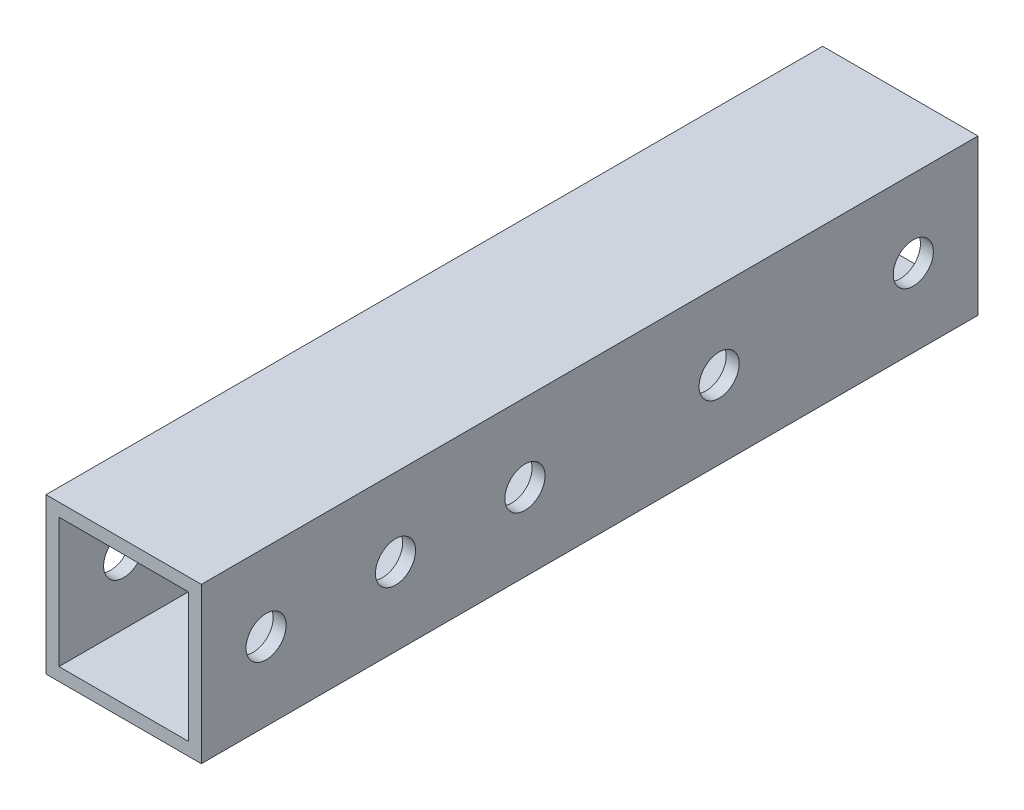
ISO-10303-21;
HEADER;
FILE_DESCRIPTION(('STEP AP214'),'2;1');
FILE_NAME('part.step','',(''),(''),'','','');
FILE_SCHEMA(('AUTOMOTIVE_DESIGN { 1 0 10303 214 1 1 1 1 }'));
ENDSEC;
DATA;
#1=APPLICATION_CONTEXT('core data for automotive mechanical design processes');
#2=APPLICATION_PROTOCOL_DEFINITION('international standard','automotive_design',2000,#1);
#3=PRODUCT_CONTEXT('',#1,'mechanical');
#4=PRODUCT('Part','Part','',(#3));
#5=PRODUCT_RELATED_PRODUCT_CATEGORY('part','',(#4));
#6=PRODUCT_DEFINITION_FORMATION('','',#4);
#7=PRODUCT_DEFINITION_CONTEXT('part definition',#1,'design');
#8=PRODUCT_DEFINITION('design','',#6,#7);
#9=PRODUCT_DEFINITION_SHAPE('','',#8);
#10=(LENGTH_UNIT() NAMED_UNIT(*) SI_UNIT(.MILLI.,.METRE.));
#11=(NAMED_UNIT(*) PLANE_ANGLE_UNIT() SI_UNIT($,.RADIAN.));
#12=(NAMED_UNIT(*) SI_UNIT($,.STERADIAN.) SOLID_ANGLE_UNIT());
#13=UNCERTAINTY_MEASURE_WITH_UNIT(LENGTH_MEASURE(1.E-05),#10,'distance_accuracy_value','');
#14=(GEOMETRIC_REPRESENTATION_CONTEXT(3) GLOBAL_UNCERTAINTY_ASSIGNED_CONTEXT((#13)) GLOBAL_UNIT_ASSIGNED_CONTEXT((#10,
#11,#12)) REPRESENTATION_CONTEXT('',''));
#15=CARTESIAN_POINT('',(0.,0.,0.));
#16=DIRECTION('',(0.,0.,1.));
#17=DIRECTION('',(1.,0.,0.));
#18=AXIS2_PLACEMENT_3D('',#15,#16,#17);
#19=CARTESIAN_POINT('',(0.,0.,60.));
#20=DIRECTION('',(0.,0.,-1.));
#21=DIRECTION('',(-1.,0.,0.));
#22=AXIS2_PLACEMENT_3D('',#19,#20,#21);
#23=PLANE('',#22);
#24=DIRECTION('',(0.,-1.,0.));
#25=VECTOR('',#24,1.);
#26=CARTESIAN_POINT('',(0.,0.,60.));
#27=LINE('',#26,#25);
#28=CARTESIAN_POINT('',(0.,12.,60.));
#29=VERTEX_POINT('',#28);
#30=CARTESIAN_POINT('',(0.,0.,60.));
#31=VERTEX_POINT('',#30);
#32=EDGE_CURVE('E164',#29,#31,#27,.T.);
#33=ORIENTED_EDGE('',*,*,#32,.T.);
#34=DIRECTION('',(1.,0.,0.));
#35=VECTOR('',#34,1.);
#36=CARTESIAN_POINT('',(0.,0.,60.));
#37=LINE('',#36,#35);
#38=CARTESIAN_POINT('',(12.,0.,60.));
#39=VERTEX_POINT('',#38);
#40=EDGE_CURVE('E168',#31,#39,#37,.T.);
#41=ORIENTED_EDGE('',*,*,#40,.T.);
#42=DIRECTION('',(0.,1.,0.));
#43=VECTOR('',#42,1.);
#44=CARTESIAN_POINT('',(12.,0.,60.));
#45=LINE('',#44,#43);
#46=CARTESIAN_POINT('',(12.,12.,60.));
#47=VERTEX_POINT('',#46);
#48=EDGE_CURVE('E172',#39,#47,#45,.T.);
#49=ORIENTED_EDGE('',*,*,#48,.T.);
#50=DIRECTION('',(-1.,0.,0.));
#51=VECTOR('',#50,1.);
#52=CARTESIAN_POINT('',(0.,12.,60.));
#53=LINE('',#52,#51);
#54=EDGE_CURVE('E175',#47,#29,#53,.T.);
#55=ORIENTED_EDGE('',*,*,#54,.T.);
#56=EDGE_LOOP('',(#33,#41,#49,#55));
#57=FACE_BOUND('',#56,.T.);
#58=DIRECTION('',(1.,0.,0.));
#59=VECTOR('',#58,1.);
#60=CARTESIAN_POINT('',(1.,1.,60.));
#61=LINE('',#60,#59);
#62=CARTESIAN_POINT('',(1.,1.,60.));
#63=VERTEX_POINT('',#62);
#64=CARTESIAN_POINT('',(11.,1.,60.));
#65=VERTEX_POINT('',#64);
#66=EDGE_CURVE('E113',#63,#65,#61,.T.);
#67=ORIENTED_EDGE('',*,*,#66,.F.);
#68=DIRECTION('',(0.,-1.,0.));
#69=VECTOR('',#68,1.);
#70=CARTESIAN_POINT('',(1.,1.,60.));
#71=LINE('',#70,#69);
#72=CARTESIAN_POINT('',(1.,11.,60.));
#73=VERTEX_POINT('',#72);
#74=EDGE_CURVE('E140',#73,#63,#71,.T.);
#75=ORIENTED_EDGE('',*,*,#74,.F.);
#76=DIRECTION('',(-1.,0.,0.));
#77=VECTOR('',#76,1.);
#78=CARTESIAN_POINT('',(1.,11.,60.));
#79=LINE('',#78,#77);
#80=CARTESIAN_POINT('',(11.,11.,60.));
#81=VERTEX_POINT('',#80);
#82=EDGE_CURVE('E135',#81,#73,#79,.T.);
#83=ORIENTED_EDGE('',*,*,#82,.F.);
#84=DIRECTION('',(0.,1.,0.));
#85=VECTOR('',#84,1.);
#86=CARTESIAN_POINT('',(11.,1.,60.));
#87=LINE('',#86,#85);
#88=EDGE_CURVE('E122',#65,#81,#87,.T.);
#89=ORIENTED_EDGE('',*,*,#88,.F.);
#90=EDGE_LOOP('',(#67,#75,#83,#89));
#91=FACE_BOUND('',#90,.T.);
#92=ADVANCED_FACE('F45',(#57,#91),#23,.F.);
#93=CARTESIAN_POINT('',(0.,0.,0.));
#94=DIRECTION('',(0.,0.,-1.));
#95=DIRECTION('',(-1.,0.,0.));
#96=AXIS2_PLACEMENT_3D('',#93,#94,#95);
#97=PLANE('',#96);
#98=DIRECTION('',(0.,-1.,0.));
#99=VECTOR('',#98,1.);
#100=CARTESIAN_POINT('',(0.,0.,0.));
#101=LINE('',#100,#99);
#102=CARTESIAN_POINT('',(0.,12.,0.));
#103=VERTEX_POINT('',#102);
#104=CARTESIAN_POINT('',(0.,0.,0.));
#105=VERTEX_POINT('',#104);
#106=EDGE_CURVE('E131',#103,#105,#101,.T.);
#107=ORIENTED_EDGE('',*,*,#106,.F.);
#108=DIRECTION('',(-1.,0.,0.));
#109=VECTOR('',#108,1.);
#110=CARTESIAN_POINT('',(0.,12.,0.));
#111=LINE('',#110,#109);
#112=CARTESIAN_POINT('',(12.,12.,0.));
#113=VERTEX_POINT('',#112);
#114=EDGE_CURVE('E169',#113,#103,#111,.T.);
#115=ORIENTED_EDGE('',*,*,#114,.F.);
#116=DIRECTION('',(0.,1.,0.));
#117=VECTOR('',#116,1.);
#118=CARTESIAN_POINT('',(12.,0.,0.));
#119=LINE('',#118,#117);
#120=CARTESIAN_POINT('',(12.,0.,0.));
#121=VERTEX_POINT('',#120);
#122=EDGE_CURVE('E184',#121,#113,#119,.T.);
#123=ORIENTED_EDGE('',*,*,#122,.F.);
#124=DIRECTION('',(1.,0.,0.));
#125=VECTOR('',#124,1.);
#126=CARTESIAN_POINT('',(0.,0.,0.));
#127=LINE('',#126,#125);
#128=EDGE_CURVE('E181',#105,#121,#127,.T.);
#129=ORIENTED_EDGE('',*,*,#128,.F.);
#130=EDGE_LOOP('',(#107,#115,#123,#129));
#131=FACE_BOUND('',#130,.T.);
#132=DIRECTION('',(0.,-1.,0.));
#133=VECTOR('',#132,1.);
#134=CARTESIAN_POINT('',(1.,1.,0.));
#135=LINE('',#134,#133);
#136=CARTESIAN_POINT('',(1.,11.,0.));
#137=VERTEX_POINT('',#136);
#138=CARTESIAN_POINT('',(1.,1.,0.));
#139=VERTEX_POINT('',#138);
#140=EDGE_CURVE('E123',#137,#139,#135,.T.);
#141=ORIENTED_EDGE('',*,*,#140,.T.);
#142=DIRECTION('',(1.,0.,0.));
#143=VECTOR('',#142,1.);
#144=CARTESIAN_POINT('',(1.,1.,0.));
#145=LINE('',#144,#143);
#146=CARTESIAN_POINT('',(11.,1.,0.));
#147=VERTEX_POINT('',#146);
#148=EDGE_CURVE('E71',#139,#147,#145,.T.);
#149=ORIENTED_EDGE('',*,*,#148,.T.);
#150=DIRECTION('',(0.,1.,0.));
#151=VECTOR('',#150,1.);
#152=CARTESIAN_POINT('',(11.,1.,0.));
#153=LINE('',#152,#151);
#154=CARTESIAN_POINT('',(11.,11.,0.));
#155=VERTEX_POINT('',#154);
#156=EDGE_CURVE('E129',#147,#155,#153,.T.);
#157=ORIENTED_EDGE('',*,*,#156,.T.);
#158=DIRECTION('',(-1.,0.,0.));
#159=VECTOR('',#158,1.);
#160=CARTESIAN_POINT('',(1.,11.,0.));
#161=LINE('',#160,#159);
#162=EDGE_CURVE('E151',#155,#137,#161,.T.);
#163=ORIENTED_EDGE('',*,*,#162,.T.);
#164=EDGE_LOOP('',(#141,#149,#157,#163));
#165=FACE_BOUND('',#164,.T.);
#166=ADVANCED_FACE('F256',(#131,#165),#97,.T.);
#167=CARTESIAN_POINT('',(0.,0.,60.));
#168=DIRECTION('',(1.,0.,0.));
#169=DIRECTION('',(0.,0.,-1.));
#170=AXIS2_PLACEMENT_3D('',#167,#168,#169);
#171=PLANE('',#170);
#172=CARTESIAN_POINT('',(0.,6.,55.));
#173=DIRECTION('',(1.,0.,0.));
#174=DIRECTION('',(0.,0.,-1.));
#175=AXIS2_PLACEMENT_3D('',#172,#173,#174);
#176=CIRCLE('',#175,1.55);
#177=CARTESIAN_POINT('',(0.,6.,53.45));
#178=VERTEX_POINT('',#177);
#179=EDGE_CURVE('E302',#178,#178,#176,.T.);
#180=ORIENTED_EDGE('',*,*,#179,.T.);
#181=EDGE_LOOP('',(#180));
#182=FACE_BOUND('',#181,.T.);
#183=CARTESIAN_POINT('',(0.,6.00000000000001,5.));
#184=DIRECTION('',(1.,0.,0.));
#185=DIRECTION('',(0.,0.,-1.));
#186=AXIS2_PLACEMENT_3D('',#183,#184,#185);
#187=CIRCLE('',#186,1.55);
#188=CARTESIAN_POINT('',(0.,6.00000000000001,3.45));
#189=VERTEX_POINT('',#188);
#190=EDGE_CURVE('E306',#189,#189,#187,.T.);
#191=ORIENTED_EDGE('',*,*,#190,.T.);
#192=EDGE_LOOP('',(#191));
#193=FACE_BOUND('',#192,.T.);
#194=CARTESIAN_POINT('',(0.,6.00000000000001,20.));
#195=DIRECTION('',(1.,0.,0.));
#196=DIRECTION('',(0.,0.,-1.));
#197=AXIS2_PLACEMENT_3D('',#194,#195,#196);
#198=CIRCLE('',#197,1.55);
#199=CARTESIAN_POINT('',(0.,6.00000000000001,18.45));
#200=VERTEX_POINT('',#199);
#201=EDGE_CURVE('E310',#200,#200,#198,.T.);
#202=ORIENTED_EDGE('',*,*,#201,.T.);
#203=EDGE_LOOP('',(#202));
#204=FACE_BOUND('',#203,.T.);
#205=CARTESIAN_POINT('',(0.,6.,35.));
#206=DIRECTION('',(1.,0.,0.));
#207=DIRECTION('',(0.,0.,-1.));
#208=AXIS2_PLACEMENT_3D('',#205,#206,#207);
#209=CIRCLE('',#208,1.55);
#210=CARTESIAN_POINT('',(0.,6.,33.45));
#211=VERTEX_POINT('',#210);
#212=EDGE_CURVE('E314',#211,#211,#209,.T.);
#213=ORIENTED_EDGE('',*,*,#212,.T.);
#214=EDGE_LOOP('',(#213));
#215=FACE_BOUND('',#214,.T.);
#216=CARTESIAN_POINT('',(0.,6.,45.));
#217=DIRECTION('',(1.,0.,0.));
#218=DIRECTION('',(0.,0.,-1.));
#219=AXIS2_PLACEMENT_3D('',#216,#217,#218);
#220=CIRCLE('',#219,1.55);
#221=CARTESIAN_POINT('',(0.,6.,43.45));
#222=VERTEX_POINT('',#221);
#223=EDGE_CURVE('E204',#222,#222,#220,.T.);
#224=ORIENTED_EDGE('',*,*,#223,.T.);
#225=EDGE_LOOP('',(#224));
#226=FACE_BOUND('',#225,.T.);
#227=ORIENTED_EDGE('',*,*,#106,.T.);
#228=DIRECTION('',(0.,0.,-1.));
#229=VECTOR('',#228,1.);
#230=CARTESIAN_POINT('',(0.,0.,60.));
#231=LINE('',#230,#229);
#232=EDGE_CURVE('E11',#31,#105,#231,.T.);
#233=ORIENTED_EDGE('',*,*,#232,.F.);
#234=ORIENTED_EDGE('',*,*,#32,.F.);
#235=DIRECTION('',(0.,0.,-1.));
#236=VECTOR('',#235,1.);
#237=CARTESIAN_POINT('',(0.,12.,60.));
#238=LINE('',#237,#236);
#239=EDGE_CURVE('E178',#29,#103,#238,.T.);
#240=ORIENTED_EDGE('',*,*,#239,.T.);
#241=EDGE_LOOP('',(#227,#233,#234,#240));
#242=FACE_BOUND('',#241,.T.);
#243=ADVANCED_FACE('F47',(#182,#193,#204,#215,#226,#242),#171,.F.);
#244=CARTESIAN_POINT('',(0.,0.,60.));
#245=DIRECTION('',(0.,1.,0.));
#246=DIRECTION('',(0.,0.,1.));
#247=AXIS2_PLACEMENT_3D('',#244,#245,#246);
#248=PLANE('',#247);
#249=ORIENTED_EDGE('',*,*,#128,.T.);
#250=DIRECTION('',(0.,0.,-1.));
#251=VECTOR('',#250,1.);
#252=CARTESIAN_POINT('',(12.,0.,60.));
#253=LINE('',#252,#251);
#254=EDGE_CURVE('E55',#39,#121,#253,.T.);
#255=ORIENTED_EDGE('',*,*,#254,.F.);
#256=ORIENTED_EDGE('',*,*,#40,.F.);
#257=ORIENTED_EDGE('',*,*,#232,.T.);
#258=EDGE_LOOP('',(#249,#255,#256,#257));
#259=FACE_BOUND('',#258,.T.);
#260=ADVANCED_FACE('F279',(#259),#248,.F.);
#261=CARTESIAN_POINT('',(12.,0.,60.));
#262=DIRECTION('',(-1.,0.,0.));
#263=DIRECTION('',(0.,0.,1.));
#264=AXIS2_PLACEMENT_3D('',#261,#262,#263);
#265=PLANE('',#264);
#266=CARTESIAN_POINT('',(12.,6.,55.));
#267=DIRECTION('',(1.,0.,0.));
#268=DIRECTION('',(0.,0.,-1.));
#269=AXIS2_PLACEMENT_3D('',#266,#267,#268);
#270=CIRCLE('',#269,1.55);
#271=CARTESIAN_POINT('',(12.,6.,53.45));
#272=VERTEX_POINT('',#271);
#273=EDGE_CURVE('E324',#272,#272,#270,.T.);
#274=ORIENTED_EDGE('',*,*,#273,.F.);
#275=EDGE_LOOP('',(#274));
#276=FACE_BOUND('',#275,.T.);
#277=CARTESIAN_POINT('',(12.,6.00000000000001,5.));
#278=DIRECTION('',(1.,0.,0.));
#279=DIRECTION('',(0.,0.,-1.));
#280=AXIS2_PLACEMENT_3D('',#277,#278,#279);
#281=CIRCLE('',#280,1.55);
#282=CARTESIAN_POINT('',(12.,6.00000000000001,3.45));
#283=VERTEX_POINT('',#282);
#284=EDGE_CURVE('E374',#283,#283,#281,.T.);
#285=ORIENTED_EDGE('',*,*,#284,.F.);
#286=EDGE_LOOP('',(#285));
#287=FACE_BOUND('',#286,.T.);
#288=CARTESIAN_POINT('',(12.,6.00000000000001,20.));
#289=DIRECTION('',(1.,0.,0.));
#290=DIRECTION('',(0.,0.,-1.));
#291=AXIS2_PLACEMENT_3D('',#288,#289,#290);
#292=CIRCLE('',#291,1.55);
#293=CARTESIAN_POINT('',(12.,6.00000000000001,18.45));
#294=VERTEX_POINT('',#293);
#295=EDGE_CURVE('E380',#294,#294,#292,.T.);
#296=ORIENTED_EDGE('',*,*,#295,.F.);
#297=EDGE_LOOP('',(#296));
#298=FACE_BOUND('',#297,.T.);
#299=CARTESIAN_POINT('',(12.,6.,35.));
#300=DIRECTION('',(1.,0.,0.));
#301=DIRECTION('',(0.,0.,-1.));
#302=AXIS2_PLACEMENT_3D('',#299,#300,#301);
#303=CIRCLE('',#302,1.55);
#304=CARTESIAN_POINT('',(12.,6.,33.45));
#305=VERTEX_POINT('',#304);
#306=EDGE_CURVE('E386',#305,#305,#303,.T.);
#307=ORIENTED_EDGE('',*,*,#306,.F.);
#308=EDGE_LOOP('',(#307));
#309=FACE_BOUND('',#308,.T.);
#310=CARTESIAN_POINT('',(12.,6.,45.));
#311=DIRECTION('',(1.,0.,0.));
#312=DIRECTION('',(0.,0.,-1.));
#313=AXIS2_PLACEMENT_3D('',#310,#311,#312);
#314=CIRCLE('',#313,1.55);
#315=CARTESIAN_POINT('',(12.,6.,43.45));
#316=VERTEX_POINT('',#315);
#317=EDGE_CURVE('E319',#316,#316,#314,.T.);
#318=ORIENTED_EDGE('',*,*,#317,.F.);
#319=EDGE_LOOP('',(#318));
#320=FACE_BOUND('',#319,.T.);
#321=ORIENTED_EDGE('',*,*,#122,.T.);
#322=DIRECTION('',(0.,0.,-1.));
#323=VECTOR('',#322,1.);
#324=CARTESIAN_POINT('',(12.,12.,60.));
#325=LINE('',#324,#323);
#326=EDGE_CURVE('E192',#47,#113,#325,.T.);
#327=ORIENTED_EDGE('',*,*,#326,.F.);
#328=ORIENTED_EDGE('',*,*,#48,.F.);
#329=ORIENTED_EDGE('',*,*,#254,.T.);
#330=EDGE_LOOP('',(#321,#327,#328,#329));
#331=FACE_BOUND('',#330,.T.);
#332=ADVANCED_FACE('F276',(#276,#287,#298,#309,#320,#331),#265,.F.);
#333=CARTESIAN_POINT('',(0.,12.,60.));
#334=DIRECTION('',(0.,-1.,0.));
#335=DIRECTION('',(0.,0.,-1.));
#336=AXIS2_PLACEMENT_3D('',#333,#334,#335);
#337=PLANE('',#336);
#338=ORIENTED_EDGE('',*,*,#114,.T.);
#339=ORIENTED_EDGE('',*,*,#239,.F.);
#340=ORIENTED_EDGE('',*,*,#54,.F.);
#341=ORIENTED_EDGE('',*,*,#326,.T.);
#342=EDGE_LOOP('',(#338,#339,#340,#341));
#343=FACE_BOUND('',#342,.T.);
#344=ADVANCED_FACE('F273',(#343),#337,.F.);
#345=CARTESIAN_POINT('',(1.,1.,60.));
#346=DIRECTION('',(0.,1.,0.));
#347=DIRECTION('',(0.,0.,1.));
#348=AXIS2_PLACEMENT_3D('',#345,#346,#347);
#349=PLANE('',#348);
#350=ORIENTED_EDGE('',*,*,#148,.F.);
#351=DIRECTION('',(0.,0.,-1.));
#352=VECTOR('',#351,1.);
#353=CARTESIAN_POINT('',(1.,1.,60.));
#354=LINE('',#353,#352);
#355=EDGE_CURVE('E117',#63,#139,#354,.T.);
#356=ORIENTED_EDGE('',*,*,#355,.F.);
#357=ORIENTED_EDGE('',*,*,#66,.T.);
#358=DIRECTION('',(0.,0.,-1.));
#359=VECTOR('',#358,1.);
#360=CARTESIAN_POINT('',(11.,1.,60.));
#361=LINE('',#360,#359);
#362=EDGE_CURVE('E116',#65,#147,#361,.T.);
#363=ORIENTED_EDGE('',*,*,#362,.T.);
#364=EDGE_LOOP('',(#350,#356,#357,#363));
#365=FACE_BOUND('',#364,.T.);
#366=ADVANCED_FACE('F115',(#365),#349,.T.);
#367=CARTESIAN_POINT('',(11.,1.,60.));
#368=DIRECTION('',(-1.,0.,0.));
#369=DIRECTION('',(0.,0.,1.));
#370=AXIS2_PLACEMENT_3D('',#367,#368,#369);
#371=PLANE('',#370);
#372=CARTESIAN_POINT('',(11.,6.,55.));
#373=DIRECTION('',(-1.,0.,0.));
#374=DIRECTION('',(0.,0.,1.));
#375=AXIS2_PLACEMENT_3D('',#372,#373,#374);
#376=CIRCLE('',#375,1.55);
#377=CARTESIAN_POINT('',(11.,6.,56.55));
#378=VERTEX_POINT('',#377);
#379=EDGE_CURVE('E148',#378,#378,#376,.T.);
#380=ORIENTED_EDGE('',*,*,#379,.F.);
#381=EDGE_LOOP('',(#380));
#382=FACE_BOUND('',#381,.T.);
#383=CARTESIAN_POINT('',(11.,6.00000000000001,5.));
#384=DIRECTION('',(-1.,0.,0.));
#385=DIRECTION('',(0.,0.,1.));
#386=AXIS2_PLACEMENT_3D('',#383,#384,#385);
#387=CIRCLE('',#386,1.55);
#388=CARTESIAN_POINT('',(11.,6.00000000000001,6.55));
#389=VERTEX_POINT('',#388);
#390=EDGE_CURVE('E217',#389,#389,#387,.T.);
#391=ORIENTED_EDGE('',*,*,#390,.F.);
#392=EDGE_LOOP('',(#391));
#393=FACE_BOUND('',#392,.T.);
#394=CARTESIAN_POINT('',(11.,6.00000000000001,20.));
#395=DIRECTION('',(-1.,0.,0.));
#396=DIRECTION('',(0.,0.,1.));
#397=AXIS2_PLACEMENT_3D('',#394,#395,#396);
#398=CIRCLE('',#397,1.55);
#399=CARTESIAN_POINT('',(11.,6.00000000000001,21.55));
#400=VERTEX_POINT('',#399);
#401=EDGE_CURVE('E213',#400,#400,#398,.T.);
#402=ORIENTED_EDGE('',*,*,#401,.F.);
#403=EDGE_LOOP('',(#402));
#404=FACE_BOUND('',#403,.T.);
#405=CARTESIAN_POINT('',(11.,6.,35.));
#406=DIRECTION('',(-1.,0.,0.));
#407=DIRECTION('',(0.,0.,1.));
#408=AXIS2_PLACEMENT_3D('',#405,#406,#407);
#409=CIRCLE('',#408,1.55);
#410=CARTESIAN_POINT('',(11.,6.,36.55));
#411=VERTEX_POINT('',#410);
#412=EDGE_CURVE('E209',#411,#411,#409,.T.);
#413=ORIENTED_EDGE('',*,*,#412,.F.);
#414=EDGE_LOOP('',(#413));
#415=FACE_BOUND('',#414,.T.);
#416=CARTESIAN_POINT('',(11.,6.,45.));
#417=DIRECTION('',(-1.,0.,0.));
#418=DIRECTION('',(0.,0.,1.));
#419=AXIS2_PLACEMENT_3D('',#416,#417,#418);
#420=CIRCLE('',#419,1.55);
#421=CARTESIAN_POINT('',(11.,6.,46.55));
#422=VERTEX_POINT('',#421);
#423=EDGE_CURVE('E203',#422,#422,#420,.T.);
#424=ORIENTED_EDGE('',*,*,#423,.F.);
#425=EDGE_LOOP('',(#424));
#426=FACE_BOUND('',#425,.T.);
#427=ORIENTED_EDGE('',*,*,#156,.F.);
#428=ORIENTED_EDGE('',*,*,#362,.F.);
#429=ORIENTED_EDGE('',*,*,#88,.T.);
#430=DIRECTION('',(0.,0.,-1.));
#431=VECTOR('',#430,1.);
#432=CARTESIAN_POINT('',(11.,11.,60.));
#433=LINE('',#432,#431);
#434=EDGE_CURVE('E132',#81,#155,#433,.T.);
#435=ORIENTED_EDGE('',*,*,#434,.T.);
#436=EDGE_LOOP('',(#427,#428,#429,#435));
#437=FACE_BOUND('',#436,.T.);
#438=ADVANCED_FACE('F126',(#382,#393,#404,#415,#426,#437),#371,.T.);
#439=CARTESIAN_POINT('',(1.,11.,60.));
#440=DIRECTION('',(0.,-1.,0.));
#441=DIRECTION('',(0.,0.,-1.));
#442=AXIS2_PLACEMENT_3D('',#439,#440,#441);
#443=PLANE('',#442);
#444=ORIENTED_EDGE('',*,*,#162,.F.);
#445=ORIENTED_EDGE('',*,*,#434,.F.);
#446=ORIENTED_EDGE('',*,*,#82,.T.);
#447=DIRECTION('',(0.,0.,-1.));
#448=VECTOR('',#447,1.);
#449=CARTESIAN_POINT('',(1.,11.,60.));
#450=LINE('',#449,#448);
#451=EDGE_CURVE('E63',#73,#137,#450,.T.);
#452=ORIENTED_EDGE('',*,*,#451,.T.);
#453=EDGE_LOOP('',(#444,#445,#446,#452));
#454=FACE_BOUND('',#453,.T.);
#455=ADVANCED_FACE('F246',(#454),#443,.T.);
#456=CARTESIAN_POINT('',(1.,1.,60.));
#457=DIRECTION('',(1.,0.,0.));
#458=DIRECTION('',(0.,0.,-1.));
#459=AXIS2_PLACEMENT_3D('',#456,#457,#458);
#460=PLANE('',#459);
#461=CARTESIAN_POINT('',(1.,6.,55.));
#462=DIRECTION('',(1.,0.,0.));
#463=DIRECTION('',(0.,0.,-1.));
#464=AXIS2_PLACEMENT_3D('',#461,#462,#463);
#465=CIRCLE('',#464,1.55);
#466=CARTESIAN_POINT('',(1.,6.,53.45));
#467=VERTEX_POINT('',#466);
#468=EDGE_CURVE('E49',#467,#467,#465,.T.);
#469=ORIENTED_EDGE('',*,*,#468,.F.);
#470=EDGE_LOOP('',(#469));
#471=FACE_BOUND('',#470,.T.);
#472=CARTESIAN_POINT('',(1.,6.00000000000001,5.));
#473=DIRECTION('',(1.,0.,0.));
#474=DIRECTION('',(0.,0.,-1.));
#475=AXIS2_PLACEMENT_3D('',#472,#473,#474);
#476=CIRCLE('',#475,1.55);
#477=CARTESIAN_POINT('',(1.,6.00000000000001,3.45));
#478=VERTEX_POINT('',#477);
#479=EDGE_CURVE('E214',#478,#478,#476,.T.);
#480=ORIENTED_EDGE('',*,*,#479,.F.);
#481=EDGE_LOOP('',(#480));
#482=FACE_BOUND('',#481,.T.);
#483=CARTESIAN_POINT('',(1.,6.00000000000001,20.));
#484=DIRECTION('',(1.,0.,0.));
#485=DIRECTION('',(0.,0.,-1.));
#486=AXIS2_PLACEMENT_3D('',#483,#484,#485);
#487=CIRCLE('',#486,1.55);
#488=CARTESIAN_POINT('',(1.,6.00000000000001,18.45));
#489=VERTEX_POINT('',#488);
#490=EDGE_CURVE('E210',#489,#489,#487,.T.);
#491=ORIENTED_EDGE('',*,*,#490,.F.);
#492=EDGE_LOOP('',(#491));
#493=FACE_BOUND('',#492,.T.);
#494=CARTESIAN_POINT('',(1.,6.,35.));
#495=DIRECTION('',(1.,0.,0.));
#496=DIRECTION('',(0.,0.,-1.));
#497=AXIS2_PLACEMENT_3D('',#494,#495,#496);
#498=CIRCLE('',#497,1.55);
#499=CARTESIAN_POINT('',(1.,6.,33.45));
#500=VERTEX_POINT('',#499);
#501=EDGE_CURVE('E205',#500,#500,#498,.T.);
#502=ORIENTED_EDGE('',*,*,#501,.F.);
#503=EDGE_LOOP('',(#502));
#504=FACE_BOUND('',#503,.T.);
#505=CARTESIAN_POINT('',(1.,6.,45.));
#506=DIRECTION('',(1.,0.,0.));
#507=DIRECTION('',(0.,0.,-1.));
#508=AXIS2_PLACEMENT_3D('',#505,#506,#507);
#509=CIRCLE('',#508,1.55);
#510=CARTESIAN_POINT('',(1.,6.,43.45));
#511=VERTEX_POINT('',#510);
#512=EDGE_CURVE('E199',#511,#511,#509,.T.);
#513=ORIENTED_EDGE('',*,*,#512,.F.);
#514=EDGE_LOOP('',(#513));
#515=FACE_BOUND('',#514,.T.);
#516=ORIENTED_EDGE('',*,*,#140,.F.);
#517=ORIENTED_EDGE('',*,*,#451,.F.);
#518=ORIENTED_EDGE('',*,*,#74,.T.);
#519=ORIENTED_EDGE('',*,*,#355,.T.);
#520=EDGE_LOOP('',(#516,#517,#518,#519));
#521=FACE_BOUND('',#520,.T.);
#522=ADVANCED_FACE('F242',(#471,#482,#493,#504,#515,#521),#460,.T.);
#523=CARTESIAN_POINT('',(0.,6.,45.));
#524=DIRECTION('',(1.,0.,0.));
#525=DIRECTION('',(0.,0.,-1.));
#526=AXIS2_PLACEMENT_3D('',#523,#524,#525);
#527=CYLINDRICAL_SURFACE('',#526,1.55);
#528=ORIENTED_EDGE('',*,*,#512,.T.);
#529=EDGE_LOOP('',(#528));
#530=FACE_BOUND('',#529,.T.);
#531=ORIENTED_EDGE('',*,*,#223,.F.);
#532=EDGE_LOOP('',(#531));
#533=FACE_BOUND('',#532,.T.);
#534=ADVANCED_FACE('F245',(#530,#533),#527,.F.);
#535=CARTESIAN_POINT('',(0.,6.,35.));
#536=DIRECTION('',(1.,0.,0.));
#537=DIRECTION('',(0.,0.,-1.));
#538=AXIS2_PLACEMENT_3D('',#535,#536,#537);
#539=CYLINDRICAL_SURFACE('',#538,1.55);
#540=ORIENTED_EDGE('',*,*,#501,.T.);
#541=EDGE_LOOP('',(#540));
#542=FACE_BOUND('',#541,.T.);
#543=ORIENTED_EDGE('',*,*,#212,.F.);
#544=EDGE_LOOP('',(#543));
#545=FACE_BOUND('',#544,.T.);
#546=ADVANCED_FACE('F345',(#542,#545),#539,.F.);
#547=CARTESIAN_POINT('',(0.,6.00000000000001,20.));
#548=DIRECTION('',(1.,0.,0.));
#549=DIRECTION('',(0.,0.,-1.));
#550=AXIS2_PLACEMENT_3D('',#547,#548,#549);
#551=CYLINDRICAL_SURFACE('',#550,1.55);
#552=ORIENTED_EDGE('',*,*,#490,.T.);
#553=EDGE_LOOP('',(#552));
#554=FACE_BOUND('',#553,.T.);
#555=ORIENTED_EDGE('',*,*,#201,.F.);
#556=EDGE_LOOP('',(#555));
#557=FACE_BOUND('',#556,.T.);
#558=ADVANCED_FACE('F354',(#554,#557),#551,.F.);
#559=CARTESIAN_POINT('',(0.,6.00000000000001,5.));
#560=DIRECTION('',(1.,0.,0.));
#561=DIRECTION('',(0.,0.,-1.));
#562=AXIS2_PLACEMENT_3D('',#559,#560,#561);
#563=CYLINDRICAL_SURFACE('',#562,1.55);
#564=ORIENTED_EDGE('',*,*,#479,.T.);
#565=EDGE_LOOP('',(#564));
#566=FACE_BOUND('',#565,.T.);
#567=ORIENTED_EDGE('',*,*,#190,.F.);
#568=EDGE_LOOP('',(#567));
#569=FACE_BOUND('',#568,.T.);
#570=ADVANCED_FACE('F346',(#566,#569),#563,.F.);
#571=CARTESIAN_POINT('',(0.,6.,55.));
#572=DIRECTION('',(1.,0.,0.));
#573=DIRECTION('',(0.,0.,-1.));
#574=AXIS2_PLACEMENT_3D('',#571,#572,#573);
#575=CYLINDRICAL_SURFACE('',#574,1.55);
#576=ORIENTED_EDGE('',*,*,#468,.T.);
#577=EDGE_LOOP('',(#576));
#578=FACE_BOUND('',#577,.T.);
#579=ORIENTED_EDGE('',*,*,#179,.F.);
#580=EDGE_LOOP('',(#579));
#581=FACE_BOUND('',#580,.T.);
#582=ADVANCED_FACE('F239',(#578,#581),#575,.F.);
#583=ORIENTED_EDGE('',*,*,#423,.T.);
#584=EDGE_LOOP('',(#583));
#585=FACE_BOUND('',#584,.T.);
#586=ORIENTED_EDGE('',*,*,#317,.T.);
#587=EDGE_LOOP('',(#586));
#588=FACE_BOUND('',#587,.T.);
#589=ADVANCED_FACE('F331',(#585,#588),#527,.F.);
#590=ORIENTED_EDGE('',*,*,#412,.T.);
#591=EDGE_LOOP('',(#590));
#592=FACE_BOUND('',#591,.T.);
#593=ORIENTED_EDGE('',*,*,#306,.T.);
#594=EDGE_LOOP('',(#593));
#595=FACE_BOUND('',#594,.T.);
#596=ADVANCED_FACE('F335',(#592,#595),#539,.F.);
#597=ORIENTED_EDGE('',*,*,#401,.T.);
#598=EDGE_LOOP('',(#597));
#599=FACE_BOUND('',#598,.T.);
#600=ORIENTED_EDGE('',*,*,#295,.T.);
#601=EDGE_LOOP('',(#600));
#602=FACE_BOUND('',#601,.T.);
#603=ADVANCED_FACE('F342',(#599,#602),#551,.F.);
#604=ORIENTED_EDGE('',*,*,#390,.T.);
#605=EDGE_LOOP('',(#604));
#606=FACE_BOUND('',#605,.T.);
#607=ORIENTED_EDGE('',*,*,#284,.T.);
#608=EDGE_LOOP('',(#607));
#609=FACE_BOUND('',#608,.T.);
#610=ADVANCED_FACE('F362',(#606,#609),#563,.F.);
#611=ORIENTED_EDGE('',*,*,#379,.T.);
#612=EDGE_LOOP('',(#611));
#613=FACE_BOUND('',#612,.T.);
#614=ORIENTED_EDGE('',*,*,#273,.T.);
#615=EDGE_LOOP('',(#614));
#616=FACE_BOUND('',#615,.T.);
#617=ADVANCED_FACE('F348',(#613,#616),#575,.F.);
#618=CLOSED_SHELL('',(#92,#166,#243,#260,#332,#344,#366,#438,#455,#522,#534,#546,#558,#570,#582,
#589,#596,#603,#610,#617));
#619=MANIFOLD_SOLID_BREP('B2',#618);
#620=ADVANCED_BREP_SHAPE_REPRESENTATION('',(#18,#619),#14);
#621=SHAPE_DEFINITION_REPRESENTATION(#9,#620);
ENDSEC;
END-ISO-10303-21;
